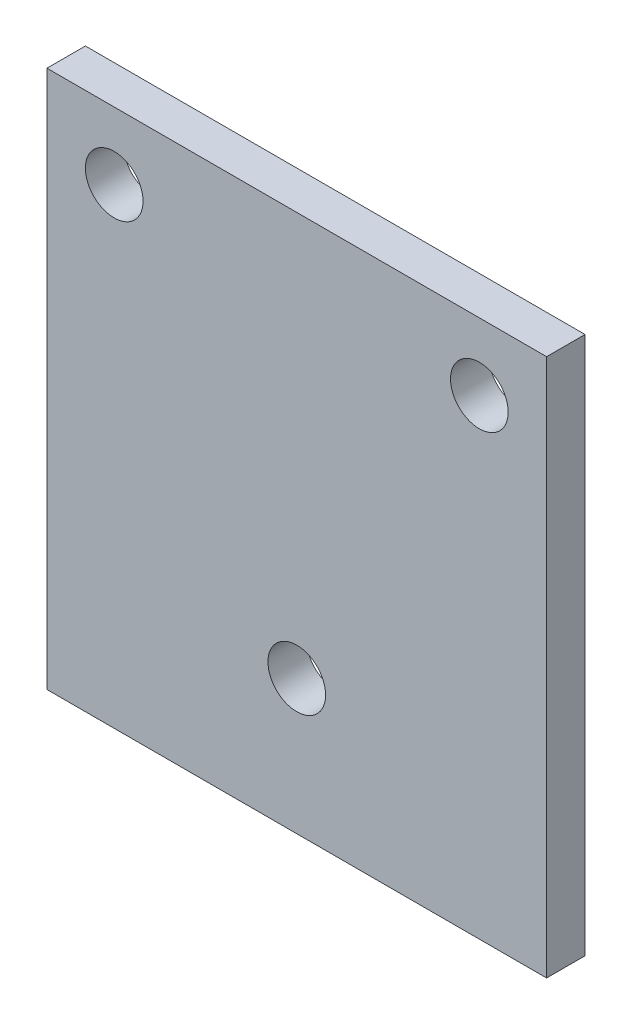
ISO-10303-21;
HEADER;
FILE_DESCRIPTION(('STEP AP214'),'2;1');
FILE_NAME('part.step','',(''),(''),'','','');
FILE_SCHEMA(('AUTOMOTIVE_DESIGN { 1 0 10303 214 1 1 1 1 }'));
ENDSEC;
DATA;
#1=APPLICATION_CONTEXT('core data for automotive mechanical design processes');
#2=APPLICATION_PROTOCOL_DEFINITION('international standard','automotive_design',2000,#1);
#3=PRODUCT_CONTEXT('',#1,'mechanical');
#4=PRODUCT('Part','Part','',(#3));
#5=PRODUCT_RELATED_PRODUCT_CATEGORY('part','',(#4));
#6=PRODUCT_DEFINITION_FORMATION('','',#4);
#7=PRODUCT_DEFINITION_CONTEXT('part definition',#1,'design');
#8=PRODUCT_DEFINITION('design','',#6,#7);
#9=PRODUCT_DEFINITION_SHAPE('','',#8);
#10=(LENGTH_UNIT() NAMED_UNIT(*) SI_UNIT(.MILLI.,.METRE.));
#11=(NAMED_UNIT(*) PLANE_ANGLE_UNIT() SI_UNIT($,.RADIAN.));
#12=(NAMED_UNIT(*) SI_UNIT($,.STERADIAN.) SOLID_ANGLE_UNIT());
#13=UNCERTAINTY_MEASURE_WITH_UNIT(LENGTH_MEASURE(1.E-05),#10,'distance_accuracy_value','');
#14=(GEOMETRIC_REPRESENTATION_CONTEXT(3) GLOBAL_UNCERTAINTY_ASSIGNED_CONTEXT((#13)) GLOBAL_UNIT_ASSIGNED_CONTEXT((#10,
#11,#12)) REPRESENTATION_CONTEXT('',''));
#15=CARTESIAN_POINT('',(0.,0.,0.));
#16=DIRECTION('',(0.,0.,1.));
#17=DIRECTION('',(1.,0.,0.));
#18=AXIS2_PLACEMENT_3D('',#15,#16,#17);
#19=CARTESIAN_POINT('',(0.,0.,2.));
#20=DIRECTION('',(0.,0.,1.));
#21=DIRECTION('',(1.,0.,0.));
#22=AXIS2_PLACEMENT_3D('',#19,#20,#21);
#23=PLANE('',#22);
#24=CARTESIAN_POINT('',(-18.3872702973605,12.0365853658537,2.));
#25=DIRECTION('',(0.,0.,1.));
#26=DIRECTION('',(-1.,0.,0.));
#27=AXIS2_PLACEMENT_3D('',#24,#25,#26);
#28=CIRCLE('',#27,1.5);
#29=CARTESIAN_POINT('',(-19.8872702973605,12.0365853658537,2.));
#30=VERTEX_POINT('',#29);
#31=EDGE_CURVE('E115',#30,#30,#28,.T.);
#32=ORIENTED_EDGE('',*,*,#31,.F.);
#33=EDGE_LOOP('',(#32));
#34=FACE_BOUND('',#33,.T.);
#35=DIRECTION('',(0.,-1.,0.));
#36=VECTOR('',#35,1.);
#37=CARTESIAN_POINT('',(-40.8872702973605,15.5365853658537,2.));
#38=LINE('',#37,#36);
#39=CARTESIAN_POINT('',(-40.8872702973605,15.5365853658537,2.));
#40=VERTEX_POINT('',#39);
#41=CARTESIAN_POINT('',(-40.8872702973605,-12.4634146341463,2.));
#42=VERTEX_POINT('',#41);
#43=EDGE_CURVE('E85',#40,#42,#38,.T.);
#44=ORIENTED_EDGE('',*,*,#43,.T.);
#45=DIRECTION('',(1.,0.,0.));
#46=VECTOR('',#45,1.);
#47=CARTESIAN_POINT('',(-40.8872702973605,-12.4634146341463,2.));
#48=LINE('',#47,#46);
#49=CARTESIAN_POINT('',(-14.8872702973605,-12.4634146341463,2.));
#50=VERTEX_POINT('',#49);
#51=EDGE_CURVE('E80',#42,#50,#48,.T.);
#52=ORIENTED_EDGE('',*,*,#51,.T.);
#53=DIRECTION('',(0.,1.,0.));
#54=VECTOR('',#53,1.);
#55=CARTESIAN_POINT('',(-14.8872702973605,15.5365853658537,2.));
#56=LINE('',#55,#54);
#57=CARTESIAN_POINT('',(-14.8872702973605,15.5365853658537,2.));
#58=VERTEX_POINT('',#57);
#59=EDGE_CURVE('E83',#50,#58,#56,.T.);
#60=ORIENTED_EDGE('',*,*,#59,.T.);
#61=DIRECTION('',(-1.,0.,0.));
#62=VECTOR('',#61,1.);
#63=CARTESIAN_POINT('',(-40.8872702973605,15.5365853658537,2.));
#64=LINE('',#63,#62);
#65=EDGE_CURVE('E50',#58,#40,#64,.T.);
#66=ORIENTED_EDGE('',*,*,#65,.T.);
#67=EDGE_LOOP('',(#44,#52,#60,#66));
#68=FACE_BOUND('',#67,.T.);
#69=CARTESIAN_POINT('',(-37.3872702973605,12.0365853658537,2.));
#70=DIRECTION('',(0.,0.,1.));
#71=DIRECTION('',(1.,0.,0.));
#72=AXIS2_PLACEMENT_3D('',#69,#70,#71);
#73=CIRCLE('',#72,1.5);
#74=CARTESIAN_POINT('',(-35.8872702973605,12.0365853658537,2.));
#75=VERTEX_POINT('',#74);
#76=EDGE_CURVE('E100',#75,#75,#73,.T.);
#77=ORIENTED_EDGE('',*,*,#76,.F.);
#78=EDGE_LOOP('',(#77));
#79=FACE_BOUND('',#78,.T.);
#80=CARTESIAN_POINT('',(-27.8872702973605,-5.46341463414634,2.));
#81=DIRECTION('',(0.,0.,1.));
#82=DIRECTION('',(1.,0.,0.));
#83=AXIS2_PLACEMENT_3D('',#80,#81,#82);
#84=CIRCLE('',#83,1.5);
#85=CARTESIAN_POINT('',(-26.3872702973605,-5.46341463414634,2.));
#86=VERTEX_POINT('',#85);
#87=EDGE_CURVE('E121',#86,#86,#84,.T.);
#88=ORIENTED_EDGE('',*,*,#87,.F.);
#89=EDGE_LOOP('',(#88));
#90=FACE_BOUND('',#89,.T.);
#91=ADVANCED_FACE('F33',(#34,#68,#79,#90),#23,.T.);
#92=CARTESIAN_POINT('',(0.,0.,0.));
#93=DIRECTION('',(0.,0.,1.));
#94=DIRECTION('',(1.,0.,0.));
#95=AXIS2_PLACEMENT_3D('',#92,#93,#94);
#96=PLANE('',#95);
#97=DIRECTION('',(0.,-1.,0.));
#98=VECTOR('',#97,1.);
#99=CARTESIAN_POINT('',(-40.8872702973605,15.5365853658537,0.));
#100=LINE('',#99,#98);
#101=CARTESIAN_POINT('',(-40.8872702973605,15.5365853658537,0.));
#102=VERTEX_POINT('',#101);
#103=CARTESIAN_POINT('',(-40.8872702973605,-12.4634146341463,0.));
#104=VERTEX_POINT('',#103);
#105=EDGE_CURVE('E97',#102,#104,#100,.T.);
#106=ORIENTED_EDGE('',*,*,#105,.F.);
#107=DIRECTION('',(-1.,0.,0.));
#108=VECTOR('',#107,1.);
#109=CARTESIAN_POINT('',(-40.8872702973605,15.5365853658537,0.));
#110=LINE('',#109,#108);
#111=CARTESIAN_POINT('',(-14.8872702973605,15.5365853658537,0.));
#112=VERTEX_POINT('',#111);
#113=EDGE_CURVE('E73',#112,#102,#110,.T.);
#114=ORIENTED_EDGE('',*,*,#113,.F.);
#115=DIRECTION('',(0.,1.,0.));
#116=VECTOR('',#115,1.);
#117=CARTESIAN_POINT('',(-14.8872702973605,15.5365853658537,0.));
#118=LINE('',#117,#116);
#119=CARTESIAN_POINT('',(-14.8872702973605,-12.4634146341463,0.));
#120=VERTEX_POINT('',#119);
#121=EDGE_CURVE('E67',#120,#112,#118,.T.);
#122=ORIENTED_EDGE('',*,*,#121,.F.);
#123=DIRECTION('',(1.,0.,0.));
#124=VECTOR('',#123,1.);
#125=CARTESIAN_POINT('',(-40.8872702973605,-12.4634146341463,0.));
#126=LINE('',#125,#124);
#127=EDGE_CURVE('E89',#104,#120,#126,.T.);
#128=ORIENTED_EDGE('',*,*,#127,.F.);
#129=EDGE_LOOP('',(#106,#114,#122,#128));
#130=FACE_BOUND('',#129,.T.);
#131=CARTESIAN_POINT('',(-37.3872702973605,12.0365853658537,0.));
#132=DIRECTION('',(0.,0.,1.));
#133=DIRECTION('',(1.,0.,0.));
#134=AXIS2_PLACEMENT_3D('',#131,#132,#133);
#135=CIRCLE('',#134,1.5);
#136=CARTESIAN_POINT('',(-35.8872702973605,12.0365853658537,0.));
#137=VERTEX_POINT('',#136);
#138=EDGE_CURVE('E112',#137,#137,#135,.T.);
#139=ORIENTED_EDGE('',*,*,#138,.T.);
#140=EDGE_LOOP('',(#139));
#141=FACE_BOUND('',#140,.T.);
#142=CARTESIAN_POINT('',(-18.3872702973605,12.0365853658537,0.));
#143=DIRECTION('',(0.,0.,1.));
#144=DIRECTION('',(-1.,0.,0.));
#145=AXIS2_PLACEMENT_3D('',#142,#143,#144);
#146=CIRCLE('',#145,1.5);
#147=CARTESIAN_POINT('',(-19.8872702973605,12.0365853658537,0.));
#148=VERTEX_POINT('',#147);
#149=EDGE_CURVE('E118',#148,#148,#146,.T.);
#150=ORIENTED_EDGE('',*,*,#149,.T.);
#151=EDGE_LOOP('',(#150));
#152=FACE_BOUND('',#151,.T.);
#153=CARTESIAN_POINT('',(-27.8872702973605,-5.46341463414634,0.));
#154=DIRECTION('',(0.,0.,1.));
#155=DIRECTION('',(1.,0.,0.));
#156=AXIS2_PLACEMENT_3D('',#153,#154,#155);
#157=CIRCLE('',#156,1.5);
#158=CARTESIAN_POINT('',(-26.3872702973605,-5.46341463414634,0.));
#159=VERTEX_POINT('',#158);
#160=EDGE_CURVE('E124',#159,#159,#157,.T.);
#161=ORIENTED_EDGE('',*,*,#160,.T.);
#162=EDGE_LOOP('',(#161));
#163=FACE_BOUND('',#162,.T.);
#164=ADVANCED_FACE('F108',(#130,#141,#152,#163),#96,.F.);
#165=CARTESIAN_POINT('',(-40.8872702973605,15.5365853658537,2.));
#166=DIRECTION('',(1.,0.,0.));
#167=DIRECTION('',(0.,1.,0.));
#168=AXIS2_PLACEMENT_3D('',#165,#166,#167);
#169=PLANE('',#168);
#170=ORIENTED_EDGE('',*,*,#105,.T.);
#171=DIRECTION('',(0.,0.,-1.));
#172=VECTOR('',#171,1.);
#173=CARTESIAN_POINT('',(-40.8872702973605,-12.4634146341463,2.));
#174=LINE('',#173,#172);
#175=EDGE_CURVE('E11',#42,#104,#174,.T.);
#176=ORIENTED_EDGE('',*,*,#175,.F.);
#177=ORIENTED_EDGE('',*,*,#43,.F.);
#178=DIRECTION('',(0.,0.,-1.));
#179=VECTOR('',#178,1.);
#180=CARTESIAN_POINT('',(-40.8872702973605,15.5365853658537,2.));
#181=LINE('',#180,#179);
#182=EDGE_CURVE('E93',#40,#102,#181,.T.);
#183=ORIENTED_EDGE('',*,*,#182,.T.);
#184=EDGE_LOOP('',(#170,#176,#177,#183));
#185=FACE_BOUND('',#184,.T.);
#186=ADVANCED_FACE('F35',(#185),#169,.F.);
#187=CARTESIAN_POINT('',(-40.8872702973605,-12.4634146341463,2.));
#188=DIRECTION('',(0.,1.,0.));
#189=DIRECTION('',(0.,0.,1.));
#190=AXIS2_PLACEMENT_3D('',#187,#188,#189);
#191=PLANE('',#190);
#192=ORIENTED_EDGE('',*,*,#127,.T.);
#193=DIRECTION('',(0.,0.,-1.));
#194=VECTOR('',#193,1.);
#195=CARTESIAN_POINT('',(-14.8872702973605,-12.4634146341463,2.));
#196=LINE('',#195,#194);
#197=EDGE_CURVE('E42',#50,#120,#196,.T.);
#198=ORIENTED_EDGE('',*,*,#197,.F.);
#199=ORIENTED_EDGE('',*,*,#51,.F.);
#200=ORIENTED_EDGE('',*,*,#175,.T.);
#201=EDGE_LOOP('',(#192,#198,#199,#200));
#202=FACE_BOUND('',#201,.T.);
#203=ADVANCED_FACE('F88',(#202),#191,.F.);
#204=CARTESIAN_POINT('',(-14.8872702973605,15.5365853658537,2.));
#205=DIRECTION('',(-1.,0.,0.));
#206=DIRECTION('',(0.,0.,1.));
#207=AXIS2_PLACEMENT_3D('',#204,#205,#206);
#208=PLANE('',#207);
#209=ORIENTED_EDGE('',*,*,#121,.T.);
#210=DIRECTION('',(0.,0.,-1.));
#211=VECTOR('',#210,1.);
#212=CARTESIAN_POINT('',(-14.8872702973605,15.5365853658537,2.));
#213=LINE('',#212,#211);
#214=EDGE_CURVE('E90',#58,#112,#213,.T.);
#215=ORIENTED_EDGE('',*,*,#214,.F.);
#216=ORIENTED_EDGE('',*,*,#59,.F.);
#217=ORIENTED_EDGE('',*,*,#197,.T.);
#218=EDGE_LOOP('',(#209,#215,#216,#217));
#219=FACE_BOUND('',#218,.T.);
#220=ADVANCED_FACE('F91',(#219),#208,.F.);
#221=CARTESIAN_POINT('',(-40.8872702973605,15.5365853658537,2.));
#222=DIRECTION('',(0.,-1.,0.));
#223=DIRECTION('',(0.,0.,-1.));
#224=AXIS2_PLACEMENT_3D('',#221,#222,#223);
#225=PLANE('',#224);
#226=ORIENTED_EDGE('',*,*,#113,.T.);
#227=ORIENTED_EDGE('',*,*,#182,.F.);
#228=ORIENTED_EDGE('',*,*,#65,.F.);
#229=ORIENTED_EDGE('',*,*,#214,.T.);
#230=EDGE_LOOP('',(#226,#227,#228,#229));
#231=FACE_BOUND('',#230,.T.);
#232=ADVANCED_FACE('F105',(#231),#225,.F.);
#233=CARTESIAN_POINT('',(-37.3872702973605,12.0365853658537,2.));
#234=DIRECTION('',(0.,0.,-1.));
#235=DIRECTION('',(-1.,0.,0.));
#236=AXIS2_PLACEMENT_3D('',#233,#234,#235);
#237=CYLINDRICAL_SURFACE('',#236,1.5);
#238=ORIENTED_EDGE('',*,*,#76,.T.);
#239=EDGE_LOOP('',(#238));
#240=FACE_BOUND('',#239,.T.);
#241=ORIENTED_EDGE('',*,*,#138,.F.);
#242=EDGE_LOOP('',(#241));
#243=FACE_BOUND('',#242,.T.);
#244=ADVANCED_FACE('F142',(#240,#243),#237,.F.);
#245=CARTESIAN_POINT('',(-18.3872702973605,12.0365853658537,2.));
#246=DIRECTION('',(0.,0.,-1.));
#247=DIRECTION('',(-1.,0.,0.));
#248=AXIS2_PLACEMENT_3D('',#245,#246,#247);
#249=CYLINDRICAL_SURFACE('',#248,1.5);
#250=ORIENTED_EDGE('',*,*,#31,.T.);
#251=EDGE_LOOP('',(#250));
#252=FACE_BOUND('',#251,.T.);
#253=ORIENTED_EDGE('',*,*,#149,.F.);
#254=EDGE_LOOP('',(#253));
#255=FACE_BOUND('',#254,.T.);
#256=ADVANCED_FACE('F188',(#252,#255),#249,.F.);
#257=CARTESIAN_POINT('',(-27.8872702973605,-5.46341463414634,2.));
#258=DIRECTION('',(0.,0.,-1.));
#259=DIRECTION('',(-1.,0.,0.));
#260=AXIS2_PLACEMENT_3D('',#257,#258,#259);
#261=CYLINDRICAL_SURFACE('',#260,1.5);
#262=ORIENTED_EDGE('',*,*,#87,.T.);
#263=EDGE_LOOP('',(#262));
#264=FACE_BOUND('',#263,.T.);
#265=ORIENTED_EDGE('',*,*,#160,.F.);
#266=EDGE_LOOP('',(#265));
#267=FACE_BOUND('',#266,.T.);
#268=ADVANCED_FACE('F130',(#264,#267),#261,.F.);
#269=CLOSED_SHELL('',(#91,#164,#186,#203,#220,#232,#244,#256,#268));
#270=MANIFOLD_SOLID_BREP('B2',#269);
#271=ADVANCED_BREP_SHAPE_REPRESENTATION('',(#18,#270),#14);
#272=SHAPE_DEFINITION_REPRESENTATION(#9,#271);
ENDSEC;
END-ISO-10303-21;
